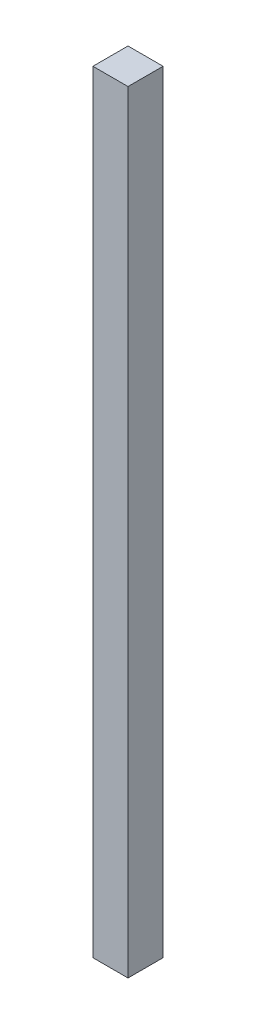
ISO-10303-21;
HEADER;
FILE_DESCRIPTION(('STEP AP214'),'2;1');
FILE_NAME('part.step','',(''),(''),'','','');
FILE_SCHEMA(('AUTOMOTIVE_DESIGN { 1 0 10303 214 1 1 1 1 }'));
ENDSEC;
DATA;
#1=APPLICATION_CONTEXT('core data for automotive mechanical design processes');
#2=APPLICATION_PROTOCOL_DEFINITION('international standard','automotive_design',2000,#1);
#3=PRODUCT_CONTEXT('',#1,'mechanical');
#4=PRODUCT('Part','Part','',(#3));
#5=PRODUCT_RELATED_PRODUCT_CATEGORY('part','',(#4));
#6=PRODUCT_DEFINITION_FORMATION('','',#4);
#7=PRODUCT_DEFINITION_CONTEXT('part definition',#1,'design');
#8=PRODUCT_DEFINITION('design','',#6,#7);
#9=PRODUCT_DEFINITION_SHAPE('','',#8);
#10=(LENGTH_UNIT() NAMED_UNIT(*) SI_UNIT(.MILLI.,.METRE.));
#11=(NAMED_UNIT(*) PLANE_ANGLE_UNIT() SI_UNIT($,.RADIAN.));
#12=(NAMED_UNIT(*) SI_UNIT($,.STERADIAN.) SOLID_ANGLE_UNIT());
#13=UNCERTAINTY_MEASURE_WITH_UNIT(LENGTH_MEASURE(1.E-05),#10,'distance_accuracy_value','');
#14=(GEOMETRIC_REPRESENTATION_CONTEXT(3) GLOBAL_UNCERTAINTY_ASSIGNED_CONTEXT((#13)) GLOBAL_UNIT_ASSIGNED_CONTEXT((#10,
#11,#12)) REPRESENTATION_CONTEXT('',''));
#15=CARTESIAN_POINT('',(0.,0.,0.));
#16=DIRECTION('',(0.,0.,1.));
#17=DIRECTION('',(1.,0.,0.));
#18=AXIS2_PLACEMENT_3D('',#15,#16,#17);
#19=CARTESIAN_POINT('',(0.,550.,0.));
#20=DIRECTION('',(-1.,0.,0.));
#21=DIRECTION('',(0.,0.,1.));
#22=AXIS2_PLACEMENT_3D('',#19,#20,#21);
#23=PLANE('',#22);
#24=DIRECTION('',(0.,0.,-1.));
#25=VECTOR('',#24,1.);
#26=CARTESIAN_POINT('',(0.,0.,0.));
#27=LINE('',#26,#25);
#28=CARTESIAN_POINT('',(0.,0.,25.));
#29=VERTEX_POINT('',#28);
#30=CARTESIAN_POINT('',(0.,0.,0.));
#31=VERTEX_POINT('',#30);
#32=EDGE_CURVE('E96',#29,#31,#27,.T.);
#33=ORIENTED_EDGE('',*,*,#32,.T.);
#34=DIRECTION('',(0.,-1.,0.));
#35=VECTOR('',#34,1.);
#36=CARTESIAN_POINT('',(0.,550.,0.));
#37=LINE('',#36,#35);
#38=CARTESIAN_POINT('',(0.,550.,0.));
#39=VERTEX_POINT('',#38);
#40=EDGE_CURVE('E11',#39,#31,#37,.T.);
#41=ORIENTED_EDGE('',*,*,#40,.F.);
#42=DIRECTION('',(0.,0.,-1.));
#43=VECTOR('',#42,1.);
#44=CARTESIAN_POINT('',(0.,550.,0.));
#45=LINE('',#44,#43);
#46=CARTESIAN_POINT('',(0.,550.,25.));
#47=VERTEX_POINT('',#46);
#48=EDGE_CURVE('E84',#47,#39,#45,.T.);
#49=ORIENTED_EDGE('',*,*,#48,.F.);
#50=DIRECTION('',(0.,-1.,0.));
#51=VECTOR('',#50,1.);
#52=CARTESIAN_POINT('',(0.,550.,25.));
#53=LINE('',#52,#51);
#54=EDGE_CURVE('E92',#47,#29,#53,.T.);
#55=ORIENTED_EDGE('',*,*,#54,.T.);
#56=EDGE_LOOP('',(#33,#41,#49,#55));
#57=FACE_BOUND('',#56,.T.);
#58=ADVANCED_FACE('F33',(#57),#23,.F.);
#59=CARTESIAN_POINT('',(0.,550.,0.));
#60=DIRECTION('',(0.,0.,1.));
#61=DIRECTION('',(1.,0.,0.));
#62=AXIS2_PLACEMENT_3D('',#59,#60,#61);
#63=PLANE('',#62);
#64=DIRECTION('',(-1.,0.,0.));
#65=VECTOR('',#64,1.);
#66=CARTESIAN_POINT('',(0.,0.,0.));
#67=LINE('',#66,#65);
#68=CARTESIAN_POINT('',(-25.,0.,0.));
#69=VERTEX_POINT('',#68);
#70=EDGE_CURVE('E88',#31,#69,#67,.T.);
#71=ORIENTED_EDGE('',*,*,#70,.T.);
#72=DIRECTION('',(0.,-1.,0.));
#73=VECTOR('',#72,1.);
#74=CARTESIAN_POINT('',(-25.,550.,0.));
#75=LINE('',#74,#73);
#76=CARTESIAN_POINT('',(-25.,550.,0.));
#77=VERTEX_POINT('',#76);
#78=EDGE_CURVE('E41',#77,#69,#75,.T.);
#79=ORIENTED_EDGE('',*,*,#78,.F.);
#80=DIRECTION('',(-1.,0.,0.));
#81=VECTOR('',#80,1.);
#82=CARTESIAN_POINT('',(0.,550.,0.));
#83=LINE('',#82,#81);
#84=EDGE_CURVE('E79',#39,#77,#83,.T.);
#85=ORIENTED_EDGE('',*,*,#84,.F.);
#86=ORIENTED_EDGE('',*,*,#40,.T.);
#87=EDGE_LOOP('',(#71,#79,#85,#86));
#88=FACE_BOUND('',#87,.T.);
#89=ADVANCED_FACE('F87',(#88),#63,.F.);
#90=CARTESIAN_POINT('',(-25.,550.,0.));
#91=DIRECTION('',(1.,0.,0.));
#92=DIRECTION('',(0.,0.,-1.));
#93=AXIS2_PLACEMENT_3D('',#90,#91,#92);
#94=PLANE('',#93);
#95=DIRECTION('',(0.,0.,1.));
#96=VECTOR('',#95,1.);
#97=CARTESIAN_POINT('',(-25.,0.,0.));
#98=LINE('',#97,#96);
#99=CARTESIAN_POINT('',(-25.,0.,25.));
#100=VERTEX_POINT('',#99);
#101=EDGE_CURVE('E66',#69,#100,#98,.T.);
#102=ORIENTED_EDGE('',*,*,#101,.T.);
#103=DIRECTION('',(0.,-1.,0.));
#104=VECTOR('',#103,1.);
#105=CARTESIAN_POINT('',(-25.,550.,25.));
#106=LINE('',#105,#104);
#107=CARTESIAN_POINT('',(-25.,550.,25.));
#108=VERTEX_POINT('',#107);
#109=EDGE_CURVE('E89',#108,#100,#106,.T.);
#110=ORIENTED_EDGE('',*,*,#109,.F.);
#111=DIRECTION('',(0.,0.,1.));
#112=VECTOR('',#111,1.);
#113=CARTESIAN_POINT('',(-25.,550.,0.));
#114=LINE('',#113,#112);
#115=EDGE_CURVE('E82',#77,#108,#114,.T.);
#116=ORIENTED_EDGE('',*,*,#115,.F.);
#117=ORIENTED_EDGE('',*,*,#78,.T.);
#118=EDGE_LOOP('',(#102,#110,#116,#117));
#119=FACE_BOUND('',#118,.T.);
#120=ADVANCED_FACE('F90',(#119),#94,.F.);
#121=CARTESIAN_POINT('',(0.,550.,25.));
#122=DIRECTION('',(0.,0.,-1.));
#123=DIRECTION('',(-1.,0.,0.));
#124=AXIS2_PLACEMENT_3D('',#121,#122,#123);
#125=PLANE('',#124);
#126=DIRECTION('',(1.,0.,0.));
#127=VECTOR('',#126,1.);
#128=CARTESIAN_POINT('',(0.,0.,25.));
#129=LINE('',#128,#127);
#130=EDGE_CURVE('E72',#100,#29,#129,.T.);
#131=ORIENTED_EDGE('',*,*,#130,.T.);
#132=ORIENTED_EDGE('',*,*,#54,.F.);
#133=DIRECTION('',(1.,0.,0.));
#134=VECTOR('',#133,1.);
#135=CARTESIAN_POINT('',(0.,550.,25.));
#136=LINE('',#135,#134);
#137=EDGE_CURVE('E49',#108,#47,#136,.T.);
#138=ORIENTED_EDGE('',*,*,#137,.F.);
#139=ORIENTED_EDGE('',*,*,#109,.T.);
#140=EDGE_LOOP('',(#131,#132,#138,#139));
#141=FACE_BOUND('',#140,.T.);
#142=ADVANCED_FACE('F103',(#141),#125,.F.);
#143=CARTESIAN_POINT('',(0.,550.,0.));
#144=DIRECTION('',(0.,-1.,0.));
#145=DIRECTION('',(0.,0.,-1.));
#146=AXIS2_PLACEMENT_3D('',#143,#144,#145);
#147=PLANE('',#146);
#148=ORIENTED_EDGE('',*,*,#48,.T.);
#149=ORIENTED_EDGE('',*,*,#84,.T.);
#150=ORIENTED_EDGE('',*,*,#115,.T.);
#151=ORIENTED_EDGE('',*,*,#137,.T.);
#152=EDGE_LOOP('',(#148,#149,#150,#151));
#153=FACE_BOUND('',#152,.T.);
#154=ADVANCED_FACE('F80',(#153),#147,.F.);
#155=CARTESIAN_POINT('',(0.,0.,0.));
#156=DIRECTION('',(0.,-1.,0.));
#157=DIRECTION('',(0.,0.,-1.));
#158=AXIS2_PLACEMENT_3D('',#155,#156,#157);
#159=PLANE('',#158);
#160=ORIENTED_EDGE('',*,*,#32,.F.);
#161=ORIENTED_EDGE('',*,*,#130,.F.);
#162=ORIENTED_EDGE('',*,*,#101,.F.);
#163=ORIENTED_EDGE('',*,*,#70,.F.);
#164=EDGE_LOOP('',(#160,#161,#162,#163));
#165=FACE_BOUND('',#164,.T.);
#166=ADVANCED_FACE('F106',(#165),#159,.T.);
#167=CLOSED_SHELL('',(#58,#89,#120,#142,#154,#166));
#168=MANIFOLD_SOLID_BREP('B2',#167);
#169=ADVANCED_BREP_SHAPE_REPRESENTATION('',(#18,#168),#14);
#170=SHAPE_DEFINITION_REPRESENTATION(#9,#169);
ENDSEC;
END-ISO-10303-21;
